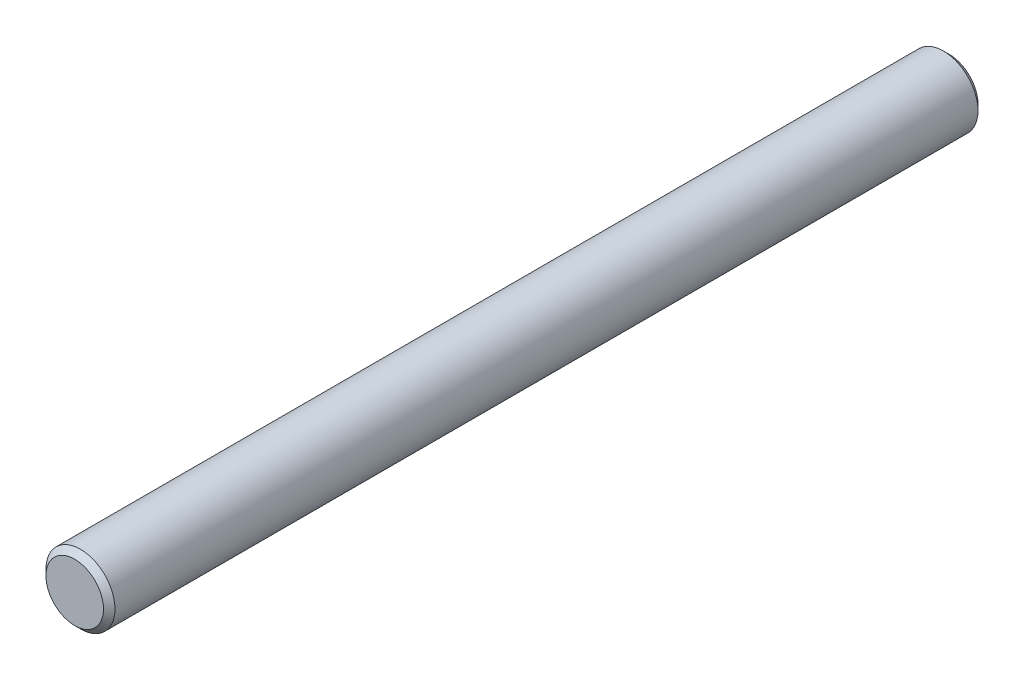
ISO-10303-21;
HEADER;
FILE_DESCRIPTION(('STEP AP214'),'2;1');
FILE_NAME('part.step','',(''),(''),'','','');
FILE_SCHEMA(('AUTOMOTIVE_DESIGN { 1 0 10303 214 1 1 1 1 }'));
ENDSEC;
DATA;
#1=APPLICATION_CONTEXT('core data for automotive mechanical design processes');
#2=APPLICATION_PROTOCOL_DEFINITION('international standard','automotive_design',2000,#1);
#3=PRODUCT_CONTEXT('',#1,'mechanical');
#4=PRODUCT('Part','Part','',(#3));
#5=PRODUCT_RELATED_PRODUCT_CATEGORY('part','',(#4));
#6=PRODUCT_DEFINITION_FORMATION('','',#4);
#7=PRODUCT_DEFINITION_CONTEXT('part definition',#1,'design');
#8=PRODUCT_DEFINITION('design','',#6,#7);
#9=PRODUCT_DEFINITION_SHAPE('','',#8);
#10=(LENGTH_UNIT() NAMED_UNIT(*) SI_UNIT(.MILLI.,.METRE.));
#11=(NAMED_UNIT(*) PLANE_ANGLE_UNIT() SI_UNIT($,.RADIAN.));
#12=(NAMED_UNIT(*) SI_UNIT($,.STERADIAN.) SOLID_ANGLE_UNIT());
#13=UNCERTAINTY_MEASURE_WITH_UNIT(LENGTH_MEASURE(1.E-05),#10,'distance_accuracy_value','');
#14=(GEOMETRIC_REPRESENTATION_CONTEXT(3) GLOBAL_UNCERTAINTY_ASSIGNED_CONTEXT((#13)) GLOBAL_UNIT_ASSIGNED_CONTEXT((#10,
#11,#12)) REPRESENTATION_CONTEXT('',''));
#15=CARTESIAN_POINT('',(0.,0.,0.));
#16=DIRECTION('',(0.,0.,1.));
#17=DIRECTION('',(1.,0.,0.));
#18=AXIS2_PLACEMENT_3D('',#15,#16,#17);
#19=CARTESIAN_POINT('',(0.,0.,38.));
#20=DIRECTION('',(0.,0.,-1.));
#21=DIRECTION('',(-1.,0.,0.));
#22=AXIS2_PLACEMENT_3D('',#19,#20,#21);
#23=CYLINDRICAL_SURFACE('',#22,1.5);
#24=CARTESIAN_POINT('',(0.,0.,0.25));
#25=DIRECTION('',(0.,0.,1.));
#26=DIRECTION('',(1.,0.,0.));
#27=AXIS2_PLACEMENT_3D('',#24,#25,#26);
#28=CIRCLE('',#27,1.5);
#29=CARTESIAN_POINT('',(1.5,0.,0.25));
#30=VERTEX_POINT('',#29);
#31=EDGE_CURVE('E41',#30,#30,#28,.T.);
#32=ORIENTED_EDGE('',*,*,#31,.T.);
#33=EDGE_LOOP('',(#32));
#34=FACE_BOUND('',#33,.T.);
#35=CARTESIAN_POINT('',(0.,0.,37.75));
#36=DIRECTION('',(0.,0.,1.));
#37=DIRECTION('',(1.,0.,0.));
#38=AXIS2_PLACEMENT_3D('',#35,#36,#37);
#39=CIRCLE('',#38,1.5);
#40=CARTESIAN_POINT('',(1.5,0.,37.75));
#41=VERTEX_POINT('',#40);
#42=EDGE_CURVE('E45',#41,#41,#39,.F.);
#43=ORIENTED_EDGE('',*,*,#42,.T.);
#44=EDGE_LOOP('',(#43));
#45=FACE_BOUND('',#44,.T.);
#46=ADVANCED_FACE('F30',(#34,#45),#23,.T.);
#47=CARTESIAN_POINT('',(0.,0.,38.));
#48=DIRECTION('',(0.,0.,1.));
#49=DIRECTION('',(1.,0.,0.));
#50=AXIS2_PLACEMENT_3D('',#47,#48,#49);
#51=PLANE('',#50);
#52=CARTESIAN_POINT('',(0.,0.,38.));
#53=DIRECTION('',(0.,0.,1.));
#54=DIRECTION('',(1.,0.,0.));
#55=AXIS2_PLACEMENT_3D('',#52,#53,#54);
#56=CIRCLE('',#55,1.25);
#57=CARTESIAN_POINT('',(1.25,0.,38.));
#58=VERTEX_POINT('',#57);
#59=EDGE_CURVE('E10',#58,#58,#56,.T.);
#60=ORIENTED_EDGE('',*,*,#59,.T.);
#61=EDGE_LOOP('',(#60));
#62=FACE_BOUND('',#61,.T.);
#63=ADVANCED_FACE('F61',(#62),#51,.T.);
#64=CARTESIAN_POINT('',(0.,0.,0.));
#65=DIRECTION('',(0.,0.,1.));
#66=DIRECTION('',(1.,0.,0.));
#67=AXIS2_PLACEMENT_3D('',#64,#65,#66);
#68=PLANE('',#67);
#69=CARTESIAN_POINT('',(0.,0.,0.));
#70=DIRECTION('',(0.,0.,1.));
#71=DIRECTION('',(1.,0.,0.));
#72=AXIS2_PLACEMENT_3D('',#69,#70,#71);
#73=CIRCLE('',#72,1.25);
#74=CARTESIAN_POINT('',(1.25,0.,0.));
#75=VERTEX_POINT('',#74);
#76=EDGE_CURVE('E37',#75,#75,#73,.F.);
#77=ORIENTED_EDGE('',*,*,#76,.T.);
#78=EDGE_LOOP('',(#77));
#79=FACE_BOUND('',#78,.T.);
#80=ADVANCED_FACE('F58',(#79),#68,.F.);
#81=CARTESIAN_POINT('',(0.,0.,0.25));
#82=DIRECTION('',(0.,0.,1.));
#83=DIRECTION('',(1.,0.,0.));
#84=AXIS2_PLACEMENT_3D('',#81,#82,#83);
#85=CONICAL_SURFACE('',#84,1.5,0.785398163397445);
#86=ORIENTED_EDGE('',*,*,#76,.F.);
#87=EDGE_LOOP('',(#86));
#88=FACE_BOUND('',#87,.T.);
#89=ORIENTED_EDGE('',*,*,#31,.F.);
#90=EDGE_LOOP('',(#89));
#91=FACE_BOUND('',#90,.T.);
#92=ADVANCED_FACE('F54',(#88,#91),#85,.T.);
#93=CARTESIAN_POINT('',(0.,0.,38.));
#94=DIRECTION('',(0.,0.,-1.));
#95=DIRECTION('',(-1.,0.,0.));
#96=AXIS2_PLACEMENT_3D('',#93,#94,#95);
#97=CONICAL_SURFACE('',#96,1.25,0.785398163397452);
#98=ORIENTED_EDGE('',*,*,#42,.F.);
#99=EDGE_LOOP('',(#98));
#100=FACE_BOUND('',#99,.T.);
#101=ORIENTED_EDGE('',*,*,#59,.F.);
#102=EDGE_LOOP('',(#101));
#103=FACE_BOUND('',#102,.T.);
#104=ADVANCED_FACE('F32',(#100,#103),#97,.T.);
#105=CLOSED_SHELL('',(#46,#63,#80,#92,#104));
#106=MANIFOLD_SOLID_BREP('B2',#105);
#107=ADVANCED_BREP_SHAPE_REPRESENTATION('',(#18,#106),#14);
#108=SHAPE_DEFINITION_REPRESENTATION(#9,#107);
ENDSEC;
END-ISO-10303-21;
